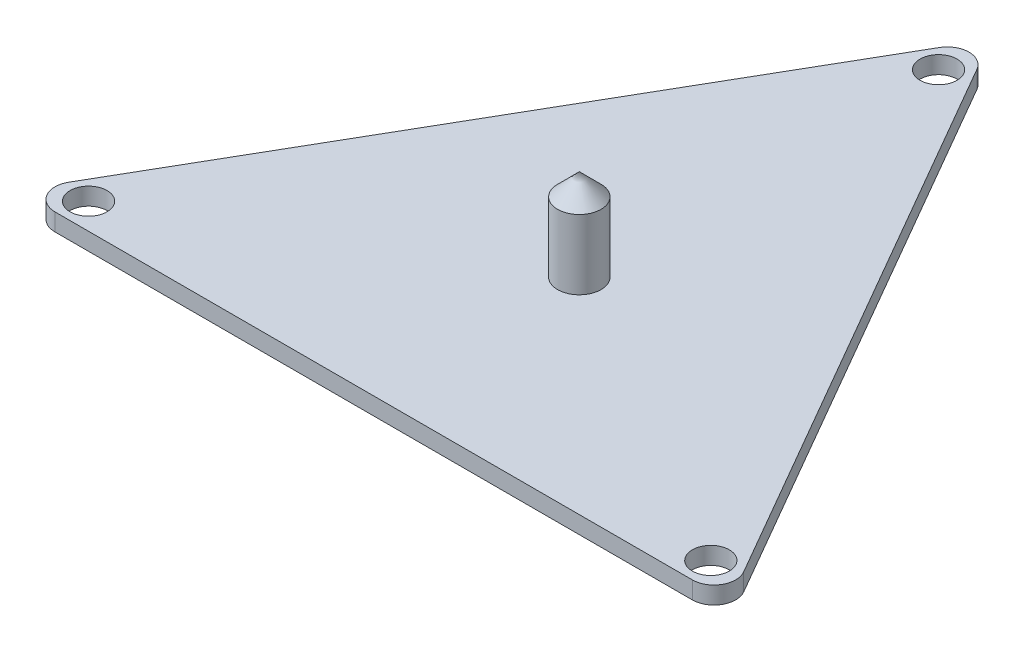
ISO-10303-21;
HEADER;
FILE_DESCRIPTION(('STEP AP214'),'2;1');
FILE_NAME('part.step','',(''),(''),'','','');
FILE_SCHEMA(('AUTOMOTIVE_DESIGN { 1 0 10303 214 1 1 1 1 }'));
ENDSEC;
DATA;
#1=APPLICATION_CONTEXT('core data for automotive mechanical design processes');
#2=APPLICATION_PROTOCOL_DEFINITION('international standard','automotive_design',2000,#1);
#3=PRODUCT_CONTEXT('',#1,'mechanical');
#4=PRODUCT('Part','Part','',(#3));
#5=PRODUCT_RELATED_PRODUCT_CATEGORY('part','',(#4));
#6=PRODUCT_DEFINITION_FORMATION('','',#4);
#7=PRODUCT_DEFINITION_CONTEXT('part definition',#1,'design');
#8=PRODUCT_DEFINITION('design','',#6,#7);
#9=PRODUCT_DEFINITION_SHAPE('','',#8);
#10=(LENGTH_UNIT() NAMED_UNIT(*) SI_UNIT(.MILLI.,.METRE.));
#11=(NAMED_UNIT(*) PLANE_ANGLE_UNIT() SI_UNIT($,.RADIAN.));
#12=(NAMED_UNIT(*) SI_UNIT($,.STERADIAN.) SOLID_ANGLE_UNIT());
#13=UNCERTAINTY_MEASURE_WITH_UNIT(LENGTH_MEASURE(1.E-05),#10,'distance_accuracy_value','');
#14=(GEOMETRIC_REPRESENTATION_CONTEXT(3) GLOBAL_UNCERTAINTY_ASSIGNED_CONTEXT((#13)) GLOBAL_UNIT_ASSIGNED_CONTEXT((#10,
#11,#12)) REPRESENTATION_CONTEXT('',''));
#15=CARTESIAN_POINT('',(0.,0.,0.));
#16=DIRECTION('',(0.,0.,1.));
#17=DIRECTION('',(1.,0.,0.));
#18=AXIS2_PLACEMENT_3D('',#15,#16,#17);
#19=CARTESIAN_POINT('',(-885.379319191775,40.,323.873484215003));
#20=DIRECTION('',(-0.866025403784439,0.,-0.5));
#21=DIRECTION('',(-0.5,0.,0.866025403784439));
#22=AXIS2_PLACEMENT_3D('',#19,#20,#21);
#23=PLANE('',#22);
#24=DIRECTION('',(0.5,0.,-0.866025403784439));
#25=VECTOR('',#24,1.);
#26=CARTESIAN_POINT('',(-885.379319191775,0.,323.873484215003));
#27=LINE('',#26,#25);
#28=CARTESIAN_POINT('',(-842.078049002553,0.,248.873484215003));
#29=VERTEX_POINT('',#28);
#30=CARTESIAN_POINT('',(-108.987544699025,0.,-1020.876515785));
#31=VERTEX_POINT('',#30);
#32=EDGE_CURVE('E127',#29,#31,#27,.T.);
#33=ORIENTED_EDGE('',*,*,#32,.F.);
#34=DIRECTION('',(0.,-1.,0.));
#35=VECTOR('',#34,1.);
#36=CARTESIAN_POINT('',(-842.078049002553,40.,248.873484215003));
#37=LINE('',#36,#35);
#38=CARTESIAN_POINT('',(-842.078049002553,40.,248.873484215003));
#39=VERTEX_POINT('',#38);
#40=EDGE_CURVE('E44',#29,#39,#37,.F.);
#41=ORIENTED_EDGE('',*,*,#40,.T.);
#42=DIRECTION('',(0.5,0.,-0.866025403784439));
#43=VECTOR('',#42,1.);
#44=CARTESIAN_POINT('',(-885.379319191775,40.,323.873484215003));
#45=LINE('',#44,#43);
#46=CARTESIAN_POINT('',(-108.987544699025,40.,-1020.876515785));
#47=VERTEX_POINT('',#46);
#48=EDGE_CURVE('E128',#39,#47,#45,.T.);
#49=ORIENTED_EDGE('',*,*,#48,.T.);
#50=DIRECTION('',(0.,-1.,0.));
#51=VECTOR('',#50,1.);
#52=CARTESIAN_POINT('',(-108.987544699026,40.,-1020.876515785));
#53=LINE('',#52,#51);
#54=EDGE_CURVE('E162',#47,#31,#53,.T.);
#55=ORIENTED_EDGE('',*,*,#54,.T.);
#56=EDGE_LOOP('',(#33,#41,#49,#55));
#57=FACE_BOUND('',#56,.T.);
#58=ADVANCED_FACE('F35',(#57),#23,.T.);
#59=CARTESIAN_POINT('',(754.006770172167,40.,323.873484215003));
#60=DIRECTION('',(0.,0.,1.));
#61=DIRECTION('',(1.,0.,0.));
#62=AXIS2_PLACEMENT_3D('',#59,#60,#61);
#63=PLANE('',#62);
#64=DIRECTION('',(-1.,0.,0.));
#65=VECTOR('',#64,1.);
#66=CARTESIAN_POINT('',(754.006770172167,0.,323.873484215003));
#67=LINE('',#66,#65);
#68=CARTESIAN_POINT('',(667.404229793724,0.,323.873484215003));
#69=VERTEX_POINT('',#68);
#70=CARTESIAN_POINT('',(-798.776778813331,0.,323.873484215003));
#71=VERTEX_POINT('',#70);
#72=EDGE_CURVE('E131',#69,#71,#67,.T.);
#73=ORIENTED_EDGE('',*,*,#72,.F.);
#74=DIRECTION('',(0.,-1.,0.));
#75=VECTOR('',#74,1.);
#76=CARTESIAN_POINT('',(667.404229793724,40.,323.873484215003));
#77=LINE('',#76,#75);
#78=CARTESIAN_POINT('',(667.404229793724,40.,323.873484215003));
#79=VERTEX_POINT('',#78);
#80=EDGE_CURVE('E155',#69,#79,#77,.F.);
#81=ORIENTED_EDGE('',*,*,#80,.T.);
#82=DIRECTION('',(-1.,0.,0.));
#83=VECTOR('',#82,1.);
#84=CARTESIAN_POINT('',(754.006770172167,40.,323.873484215003));
#85=LINE('',#84,#83);
#86=CARTESIAN_POINT('',(-798.776778813331,40.,323.873484215003));
#87=VERTEX_POINT('',#86);
#88=EDGE_CURVE('E134',#79,#87,#85,.T.);
#89=ORIENTED_EDGE('',*,*,#88,.T.);
#90=DIRECTION('',(0.,-1.,0.));
#91=VECTOR('',#90,1.);
#92=CARTESIAN_POINT('',(-798.776778813331,40.,323.873484215003));
#93=LINE('',#92,#91);
#94=EDGE_CURVE('E152',#87,#71,#93,.T.);
#95=ORIENTED_EDGE('',*,*,#94,.T.);
#96=EDGE_LOOP('',(#73,#81,#89,#95));
#97=FACE_BOUND('',#96,.T.);
#98=ADVANCED_FACE('F176',(#97),#63,.T.);
#99=CARTESIAN_POINT('',(-65.6862745098038,40.,-1095.876515785));
#100=DIRECTION('',(0.866025403784439,0.,-0.5));
#101=DIRECTION('',(-0.5,0.,-0.866025403784439));
#102=AXIS2_PLACEMENT_3D('',#99,#100,#101);
#103=PLANE('',#102);
#104=DIRECTION('',(0.5,0.,0.866025403784439));
#105=VECTOR('',#104,1.);
#106=CARTESIAN_POINT('',(-65.6862745098038,40.,-1095.876515785));
#107=LINE('',#106,#105);
#108=CARTESIAN_POINT('',(-22.3850043205818,40.,-1020.876515785));
#109=VERTEX_POINT('',#108);
#110=CARTESIAN_POINT('',(710.705499982946,40.,248.873484215004));
#111=VERTEX_POINT('',#110);
#112=EDGE_CURVE('E130',#109,#111,#107,.T.);
#113=ORIENTED_EDGE('',*,*,#112,.T.);
#114=DIRECTION('',(0.,-1.,0.));
#115=VECTOR('',#114,1.);
#116=CARTESIAN_POINT('',(710.705499982945,40.,248.873484215003));
#117=LINE('',#116,#115);
#118=CARTESIAN_POINT('',(710.705499982946,0.,248.873484215004));
#119=VERTEX_POINT('',#118);
#120=EDGE_CURVE('E144',#111,#119,#117,.T.);
#121=ORIENTED_EDGE('',*,*,#120,.T.);
#122=DIRECTION('',(0.5,0.,0.866025403784439));
#123=VECTOR('',#122,1.);
#124=CARTESIAN_POINT('',(-65.6862745098038,0.,-1095.876515785));
#125=LINE('',#124,#123);
#126=CARTESIAN_POINT('',(-22.3850043205818,0.,-1020.876515785));
#127=VERTEX_POINT('',#126);
#128=EDGE_CURVE('E139',#127,#119,#125,.T.);
#129=ORIENTED_EDGE('',*,*,#128,.F.);
#130=DIRECTION('',(0.,-1.,0.));
#131=VECTOR('',#130,1.);
#132=CARTESIAN_POINT('',(-22.3850043205818,40.,-1020.876515785));
#133=LINE('',#132,#131);
#134=EDGE_CURVE('E137',#127,#109,#133,.F.);
#135=ORIENTED_EDGE('',*,*,#134,.T.);
#136=EDGE_LOOP('',(#113,#121,#129,#135));
#137=FACE_BOUND('',#136,.T.);
#138=ADVANCED_FACE('F183',(#137),#103,.T.);
#139=CARTESIAN_POINT('',(0.,40.,0.));
#140=DIRECTION('',(0.,-1.,0.));
#141=DIRECTION('',(0.,0.,-1.));
#142=AXIS2_PLACEMENT_3D('',#139,#140,#141);
#143=PLANE('',#142);
#144=CARTESIAN_POINT('',(-65.6862745098038,40.,-149.376515784997));
#145=DIRECTION('',(0.,-1.,0.));
#146=DIRECTION('',(0.,0.,-1.));
#147=AXIS2_PLACEMENT_3D('',#144,#145,#146);
#148=CIRCLE('',#147,50.);
#149=CARTESIAN_POINT('',(-65.6862745098038,40.,-199.376515784997));
#150=VERTEX_POINT('',#149);
#151=EDGE_CURVE('E105',#150,#150,#148,.T.);
#152=ORIENTED_EDGE('',*,*,#151,.T.);
#153=EDGE_LOOP('',(#152));
#154=FACE_BOUND('',#153,.T.);
#155=CARTESIAN_POINT('',(-65.6862745098038,40.,-975.876515784996));
#156=DIRECTION('',(0.,1.,0.));
#157=DIRECTION('',(0.,0.,1.));
#158=AXIS2_PLACEMENT_3D('',#155,#156,#157);
#159=CIRCLE('',#158,42.5);
#160=CARTESIAN_POINT('',(-65.6862745098038,40.,-933.376515784996));
#161=VERTEX_POINT('',#160);
#162=EDGE_CURVE('E107',#161,#161,#159,.T.);
#163=ORIENTED_EDGE('',*,*,#162,.F.);
#164=EDGE_LOOP('',(#163));
#165=FACE_BOUND('',#164,.T.);
#166=CARTESIAN_POINT('',(-781.456270737642,40.,263.873484215003));
#167=DIRECTION('',(0.,1.,0.));
#168=DIRECTION('',(0.,0.,1.));
#169=AXIS2_PLACEMENT_3D('',#166,#167,#168);
#170=CIRCLE('',#169,42.5);
#171=CARTESIAN_POINT('',(-781.456270737642,40.,306.373484215003));
#172=VERTEX_POINT('',#171);
#173=EDGE_CURVE('E115',#172,#172,#170,.T.);
#174=ORIENTED_EDGE('',*,*,#173,.F.);
#175=EDGE_LOOP('',(#174));
#176=FACE_BOUND('',#175,.T.);
#177=CARTESIAN_POINT('',(650.083721718034,40.,263.873484215003));
#178=DIRECTION('',(0.,1.,0.));
#179=DIRECTION('',(0.,0.,1.));
#180=AXIS2_PLACEMENT_3D('',#177,#178,#179);
#181=CIRCLE('',#180,42.5);
#182=CARTESIAN_POINT('',(650.083721718034,40.,306.373484215003));
#183=VERTEX_POINT('',#182);
#184=EDGE_CURVE('E121',#183,#183,#181,.T.);
#185=ORIENTED_EDGE('',*,*,#184,.F.);
#186=EDGE_LOOP('',(#185));
#187=FACE_BOUND('',#186,.T.);
#188=ORIENTED_EDGE('',*,*,#88,.F.);
#189=CARTESIAN_POINT('',(667.404229793724,40.,273.873484215003));
#190=DIRECTION('',(0.,-1.,0.));
#191=DIRECTION('',(0.,0.,-1.));
#192=AXIS2_PLACEMENT_3D('',#189,#190,#191);
#193=CIRCLE('',#192,50.);
#194=EDGE_CURVE('E160',#79,#111,#193,.F.);
#195=ORIENTED_EDGE('',*,*,#194,.T.);
#196=ORIENTED_EDGE('',*,*,#112,.F.);
#197=CARTESIAN_POINT('',(-65.6862745098038,40.,-995.876515784996));
#198=DIRECTION('',(0.,-1.,0.));
#199=DIRECTION('',(0.,0.,-1.));
#200=AXIS2_PLACEMENT_3D('',#197,#198,#199);
#201=CIRCLE('',#200,50.);
#202=EDGE_CURVE('E51',#109,#47,#201,.F.);
#203=ORIENTED_EDGE('',*,*,#202,.T.);
#204=ORIENTED_EDGE('',*,*,#48,.F.);
#205=CARTESIAN_POINT('',(-798.776778813331,40.,273.873484215003));
#206=DIRECTION('',(0.,-1.,0.));
#207=DIRECTION('',(0.,0.,-1.));
#208=AXIS2_PLACEMENT_3D('',#205,#206,#207);
#209=CIRCLE('',#208,50.);
#210=EDGE_CURVE('E158',#39,#87,#209,.F.);
#211=ORIENTED_EDGE('',*,*,#210,.T.);
#212=EDGE_LOOP('',(#188,#195,#196,#203,#204,#211));
#213=FACE_BOUND('',#212,.T.);
#214=ADVANCED_FACE('F171',(#154,#165,#176,#187,#213),#143,.F.);
#215=CARTESIAN_POINT('',(0.,0.,0.));
#216=DIRECTION('',(0.,-1.,0.));
#217=DIRECTION('',(0.,0.,-1.));
#218=AXIS2_PLACEMENT_3D('',#215,#216,#217);
#219=PLANE('',#218);
#220=CARTESIAN_POINT('',(-65.6862745098038,0.,-975.876515784996));
#221=DIRECTION('',(0.,1.,0.));
#222=DIRECTION('',(0.,0.,1.));
#223=AXIS2_PLACEMENT_3D('',#220,#221,#222);
#224=CIRCLE('',#223,42.5);
#225=CARTESIAN_POINT('',(-65.6862745098038,0.,-933.376515784996));
#226=VERTEX_POINT('',#225);
#227=EDGE_CURVE('E110',#226,#226,#224,.T.);
#228=ORIENTED_EDGE('',*,*,#227,.T.);
#229=EDGE_LOOP('',(#228));
#230=FACE_BOUND('',#229,.T.);
#231=CARTESIAN_POINT('',(-781.456270737642,0.,263.873484215003));
#232=DIRECTION('',(0.,1.,0.));
#233=DIRECTION('',(0.,0.,1.));
#234=AXIS2_PLACEMENT_3D('',#231,#232,#233);
#235=CIRCLE('',#234,42.5);
#236=CARTESIAN_POINT('',(-781.456270737642,0.,306.373484215003));
#237=VERTEX_POINT('',#236);
#238=EDGE_CURVE('E118',#237,#237,#235,.T.);
#239=ORIENTED_EDGE('',*,*,#238,.T.);
#240=EDGE_LOOP('',(#239));
#241=FACE_BOUND('',#240,.T.);
#242=CARTESIAN_POINT('',(650.083721718034,0.,263.873484215003));
#243=DIRECTION('',(0.,1.,0.));
#244=DIRECTION('',(0.,0.,1.));
#245=AXIS2_PLACEMENT_3D('',#242,#243,#244);
#246=CIRCLE('',#245,42.5);
#247=CARTESIAN_POINT('',(650.083721718034,0.,306.373484215003));
#248=VERTEX_POINT('',#247);
#249=EDGE_CURVE('E124',#248,#248,#246,.T.);
#250=ORIENTED_EDGE('',*,*,#249,.T.);
#251=EDGE_LOOP('',(#250));
#252=FACE_BOUND('',#251,.T.);
#253=ORIENTED_EDGE('',*,*,#128,.T.);
#254=CARTESIAN_POINT('',(667.404229793724,0.,273.873484215003));
#255=DIRECTION('',(0.,-1.,0.));
#256=DIRECTION('',(0.,0.,-1.));
#257=AXIS2_PLACEMENT_3D('',#254,#255,#256);
#258=CIRCLE('',#257,50.);
#259=EDGE_CURVE('E150',#119,#69,#258,.T.);
#260=ORIENTED_EDGE('',*,*,#259,.T.);
#261=ORIENTED_EDGE('',*,*,#72,.T.);
#262=CARTESIAN_POINT('',(-798.776778813331,0.,273.873484215003));
#263=DIRECTION('',(0.,-1.,0.));
#264=DIRECTION('',(0.,0.,-1.));
#265=AXIS2_PLACEMENT_3D('',#262,#263,#264);
#266=CIRCLE('',#265,50.);
#267=EDGE_CURVE('E148',#71,#29,#266,.T.);
#268=ORIENTED_EDGE('',*,*,#267,.T.);
#269=ORIENTED_EDGE('',*,*,#32,.T.);
#270=CARTESIAN_POINT('',(-65.6862745098038,0.,-995.876515784996));
#271=DIRECTION('',(0.,-1.,0.));
#272=DIRECTION('',(0.,0.,-1.));
#273=AXIS2_PLACEMENT_3D('',#270,#271,#272);
#274=CIRCLE('',#273,50.);
#275=EDGE_CURVE('E88',#31,#127,#274,.T.);
#276=ORIENTED_EDGE('',*,*,#275,.T.);
#277=EDGE_LOOP('',(#253,#260,#261,#268,#269,#276));
#278=FACE_BOUND('',#277,.T.);
#279=ADVANCED_FACE('F178',(#230,#241,#252,#278),#219,.T.);
#280=CARTESIAN_POINT('',(650.083721718034,40.,263.873484215003));
#281=DIRECTION('',(0.,1.,0.));
#282=DIRECTION('',(0.,0.,1.));
#283=AXIS2_PLACEMENT_3D('',#280,#281,#282);
#284=CYLINDRICAL_SURFACE('',#283,42.5);
#285=ORIENTED_EDGE('',*,*,#249,.F.);
#286=EDGE_LOOP('',(#285));
#287=FACE_BOUND('',#286,.T.);
#288=ORIENTED_EDGE('',*,*,#184,.T.);
#289=EDGE_LOOP('',(#288));
#290=FACE_BOUND('',#289,.T.);
#291=ADVANCED_FACE('F244',(#287,#290),#284,.F.);
#292=CARTESIAN_POINT('',(-781.456270737642,40.,263.873484215003));
#293=DIRECTION('',(0.,1.,0.));
#294=DIRECTION('',(0.,0.,1.));
#295=AXIS2_PLACEMENT_3D('',#292,#293,#294);
#296=CYLINDRICAL_SURFACE('',#295,42.5);
#297=ORIENTED_EDGE('',*,*,#238,.F.);
#298=EDGE_LOOP('',(#297));
#299=FACE_BOUND('',#298,.T.);
#300=ORIENTED_EDGE('',*,*,#173,.T.);
#301=EDGE_LOOP('',(#300));
#302=FACE_BOUND('',#301,.T.);
#303=ADVANCED_FACE('F235',(#299,#302),#296,.F.);
#304=CARTESIAN_POINT('',(-65.6862745098038,40.,-975.876515784996));
#305=DIRECTION('',(0.,1.,0.));
#306=DIRECTION('',(0.,0.,1.));
#307=AXIS2_PLACEMENT_3D('',#304,#305,#306);
#308=CYLINDRICAL_SURFACE('',#307,42.5);
#309=ORIENTED_EDGE('',*,*,#227,.F.);
#310=EDGE_LOOP('',(#309));
#311=FACE_BOUND('',#310,.T.);
#312=ORIENTED_EDGE('',*,*,#162,.T.);
#313=EDGE_LOOP('',(#312));
#314=FACE_BOUND('',#313,.T.);
#315=ADVANCED_FACE('F101',(#311,#314),#308,.F.);
#316=CARTESIAN_POINT('',(-65.6862745098038,250.,-149.376515784997));
#317=DIRECTION('',(0.,-1.,0.));
#318=DIRECTION('',(0.,0.,-1.));
#319=AXIS2_PLACEMENT_3D('',#316,#317,#318);
#320=CYLINDRICAL_SURFACE('',#319,50.);
#321=CARTESIAN_POINT('',(-65.6862745098038,200.,-149.376515784997));
#322=DIRECTION('',(0.,-1.,0.));
#323=DIRECTION('',(0.,0.,-1.));
#324=AXIS2_PLACEMENT_3D('',#321,#322,#323);
#325=CIRCLE('',#324,50.);
#326=CARTESIAN_POINT('',(-65.6862745098038,200.,-199.376515784997));
#327=VERTEX_POINT('',#326);
#328=EDGE_CURVE('E11',#327,#327,#325,.T.);
#329=ORIENTED_EDGE('',*,*,#328,.T.);
#330=EDGE_LOOP('',(#329));
#331=FACE_BOUND('',#330,.T.);
#332=ORIENTED_EDGE('',*,*,#151,.F.);
#333=EDGE_LOOP('',(#332));
#334=FACE_BOUND('',#333,.T.);
#335=ADVANCED_FACE('F97',(#331,#334),#320,.T.);
#336=CARTESIAN_POINT('',(667.404229793724,40.,273.873484215003));
#337=DIRECTION('',(0.,-1.,0.));
#338=DIRECTION('',(0.,0.,-1.));
#339=AXIS2_PLACEMENT_3D('',#336,#337,#338);
#340=CYLINDRICAL_SURFACE('',#339,50.);
#341=ORIENTED_EDGE('',*,*,#194,.F.);
#342=ORIENTED_EDGE('',*,*,#80,.F.);
#343=ORIENTED_EDGE('',*,*,#259,.F.);
#344=ORIENTED_EDGE('',*,*,#120,.F.);
#345=EDGE_LOOP('',(#341,#342,#343,#344));
#346=FACE_BOUND('',#345,.T.);
#347=ADVANCED_FACE('F100',(#346),#340,.T.);
#348=CARTESIAN_POINT('',(-798.776778813331,40.,273.873484215003));
#349=DIRECTION('',(0.,-1.,0.));
#350=DIRECTION('',(0.,0.,-1.));
#351=AXIS2_PLACEMENT_3D('',#348,#349,#350);
#352=CYLINDRICAL_SURFACE('',#351,50.);
#353=ORIENTED_EDGE('',*,*,#210,.F.);
#354=ORIENTED_EDGE('',*,*,#40,.F.);
#355=ORIENTED_EDGE('',*,*,#267,.F.);
#356=ORIENTED_EDGE('',*,*,#94,.F.);
#357=EDGE_LOOP('',(#353,#354,#355,#356));
#358=FACE_BOUND('',#357,.T.);
#359=ADVANCED_FACE('F173',(#358),#352,.T.);
#360=CARTESIAN_POINT('',(-65.6862745098038,40.,-995.876515784996));
#361=DIRECTION('',(0.,-1.,0.));
#362=DIRECTION('',(0.,0.,-1.));
#363=AXIS2_PLACEMENT_3D('',#360,#361,#362);
#364=CYLINDRICAL_SURFACE('',#363,50.);
#365=ORIENTED_EDGE('',*,*,#202,.F.);
#366=ORIENTED_EDGE('',*,*,#134,.F.);
#367=ORIENTED_EDGE('',*,*,#275,.F.);
#368=ORIENTED_EDGE('',*,*,#54,.F.);
#369=EDGE_LOOP('',(#365,#366,#367,#368));
#370=FACE_BOUND('',#369,.T.);
#371=ADVANCED_FACE('F94',(#370),#364,.T.);
#372=CARTESIAN_POINT('',(-65.6862745098038,200.,-149.376515784997));
#373=DIRECTION('',(0.,-1.,0.));
#374=DIRECTION('',(0.,0.,-1.));
#375=AXIS2_PLACEMENT_3D('',#372,#373,#374);
#376=CONICAL_SURFACE('',#375,50.,0.78539816339745);
#377=CARTESIAN_POINT('',(-65.6862745098038,250.,-149.376515784997));
#378=VERTEX_POINT('',#377);
#379=VERTEX_LOOP('',#378);
#380=FACE_BOUND('',#379,.T.);
#381=ORIENTED_EDGE('',*,*,#328,.F.);
#382=EDGE_LOOP('',(#381));
#383=FACE_BOUND('',#382,.T.);
#384=ADVANCED_FACE('F37',(#380,#383),#376,.T.);
#385=CLOSED_SHELL('',(#58,#98,#138,#214,#279,#291,#303,#315,#335,#347,#359,#371,#384));
#386=MANIFOLD_SOLID_BREP('B2',#385);
#387=ADVANCED_BREP_SHAPE_REPRESENTATION('',(#18,#386),#14);
#388=SHAPE_DEFINITION_REPRESENTATION(#9,#387);
ENDSEC;
END-ISO-10303-21;
